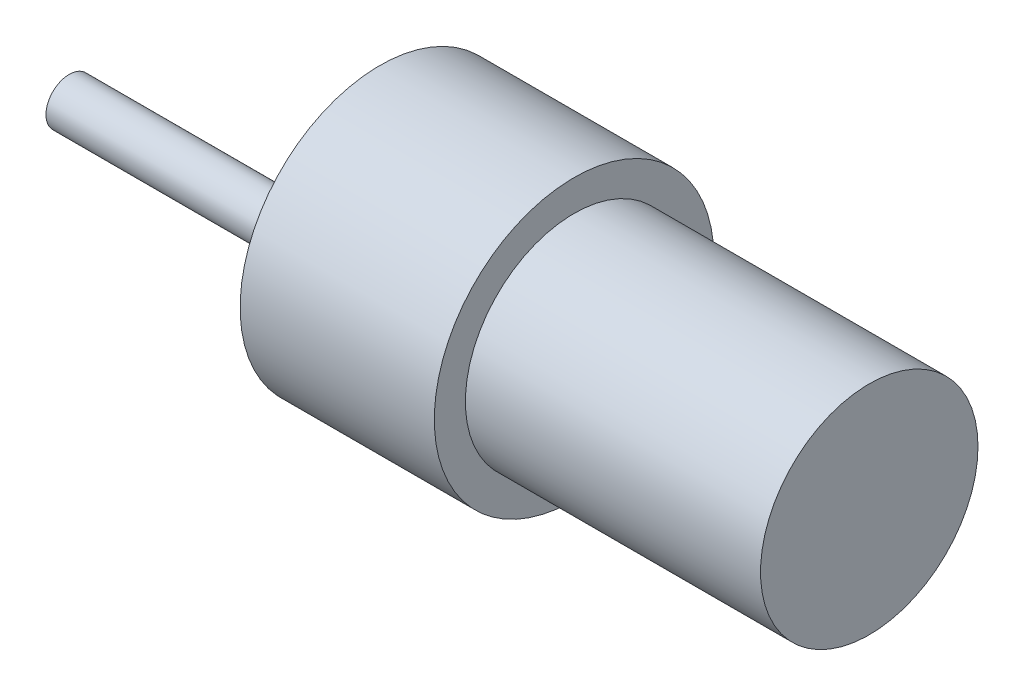
ISO-10303-21;
HEADER;
FILE_DESCRIPTION(('STEP AP214'),'2;1');
FILE_NAME('part.step','',(''),(''),'','','');
FILE_SCHEMA(('AUTOMOTIVE_DESIGN { 1 0 10303 214 1 1 1 1 }'));
ENDSEC;
DATA;
#1=APPLICATION_CONTEXT('core data for automotive mechanical design processes');
#2=APPLICATION_PROTOCOL_DEFINITION('international standard','automotive_design',2000,#1);
#3=PRODUCT_CONTEXT('',#1,'mechanical');
#4=PRODUCT('Part','Part','',(#3));
#5=PRODUCT_RELATED_PRODUCT_CATEGORY('part','',(#4));
#6=PRODUCT_DEFINITION_FORMATION('','',#4);
#7=PRODUCT_DEFINITION_CONTEXT('part definition',#1,'design');
#8=PRODUCT_DEFINITION('design','',#6,#7);
#9=PRODUCT_DEFINITION_SHAPE('','',#8);
#10=(LENGTH_UNIT() NAMED_UNIT(*) SI_UNIT(.MILLI.,.METRE.));
#11=(NAMED_UNIT(*) PLANE_ANGLE_UNIT() SI_UNIT($,.RADIAN.));
#12=(NAMED_UNIT(*) SI_UNIT($,.STERADIAN.) SOLID_ANGLE_UNIT());
#13=UNCERTAINTY_MEASURE_WITH_UNIT(LENGTH_MEASURE(1.E-05),#10,'distance_accuracy_value','');
#14=(GEOMETRIC_REPRESENTATION_CONTEXT(3) GLOBAL_UNCERTAINTY_ASSIGNED_CONTEXT((#13)) GLOBAL_UNIT_ASSIGNED_CONTEXT((#10,
#11,#12)) REPRESENTATION_CONTEXT('',''));
#15=CARTESIAN_POINT('',(0.,0.,0.));
#16=DIRECTION('',(0.,0.,1.));
#17=DIRECTION('',(1.,0.,0.));
#18=AXIS2_PLACEMENT_3D('',#15,#16,#17);
#19=CARTESIAN_POINT('',(46.3930952812002,0.,0.));
#20=DIRECTION('',(-1.,0.,0.));
#21=DIRECTION('',(0.,0.,1.));
#22=AXIS2_PLACEMENT_3D('',#19,#20,#21);
#23=PLANE('',#22);
#24=CARTESIAN_POINT('',(46.3930952812002,-6.,0.));
#25=DIRECTION('',(-1.,0.,0.));
#26=DIRECTION('',(0.,0.,1.));
#27=AXIS2_PLACEMENT_3D('',#24,#25,#26);
#28=CIRCLE('',#27,6.);
#29=CARTESIAN_POINT('',(46.3930952812002,-6.,6.));
#30=VERTEX_POINT('',#29);
#31=EDGE_CURVE('E10',#30,#30,#28,.T.);
#32=ORIENTED_EDGE('',*,*,#31,.F.);
#33=EDGE_LOOP('',(#32));
#34=FACE_BOUND('',#33,.T.);
#35=CARTESIAN_POINT('',(46.3930952812002,0.,0.));
#36=DIRECTION('',(1.,0.,0.));
#37=DIRECTION('',(0.,0.,-1.));
#38=AXIS2_PLACEMENT_3D('',#35,#36,#37);
#39=CIRCLE('',#38,18.);
#40=CARTESIAN_POINT('',(46.3930952812002,0.,-18.));
#41=VERTEX_POINT('',#40);
#42=EDGE_CURVE('E36',#41,#41,#39,.T.);
#43=ORIENTED_EDGE('',*,*,#42,.F.);
#44=EDGE_LOOP('',(#43));
#45=FACE_BOUND('',#44,.T.);
#46=ADVANCED_FACE('F30',(#34,#45),#23,.T.);
#47=CARTESIAN_POINT('',(109.3930952812,0.,0.));
#48=DIRECTION('',(1.,0.,0.));
#49=DIRECTION('',(0.,0.,-1.));
#50=AXIS2_PLACEMENT_3D('',#47,#48,#49);
#51=CYLINDRICAL_SURFACE('',#50,18.);
#52=ORIENTED_EDGE('',*,*,#42,.T.);
#53=EDGE_LOOP('',(#52));
#54=FACE_BOUND('',#53,.T.);
#55=CARTESIAN_POINT('',(71.3930952812002,0.,0.));
#56=DIRECTION('',(1.,0.,0.));
#57=DIRECTION('',(0.,0.,-1.));
#58=AXIS2_PLACEMENT_3D('',#55,#56,#57);
#59=CIRCLE('',#58,18.);
#60=CARTESIAN_POINT('',(71.3930952812002,0.,-18.));
#61=VERTEX_POINT('',#60);
#62=EDGE_CURVE('E40',#61,#61,#59,.T.);
#63=ORIENTED_EDGE('',*,*,#62,.F.);
#64=EDGE_LOOP('',(#63));
#65=FACE_BOUND('',#64,.T.);
#66=ADVANCED_FACE('F74',(#54,#65),#51,.T.);
#67=CARTESIAN_POINT('',(71.3930952812002,18.,0.));
#68=DIRECTION('',(1.,0.,0.));
#69=DIRECTION('',(0.,0.,-1.));
#70=AXIS2_PLACEMENT_3D('',#67,#68,#69);
#71=PLANE('',#70);
#72=ORIENTED_EDGE('',*,*,#62,.T.);
#73=EDGE_LOOP('',(#72));
#74=FACE_BOUND('',#73,.T.);
#75=CARTESIAN_POINT('',(71.3930952812002,0.,0.));
#76=DIRECTION('',(1.,0.,0.));
#77=DIRECTION('',(0.,0.,-1.));
#78=AXIS2_PLACEMENT_3D('',#75,#76,#77);
#79=CIRCLE('',#78,14.);
#80=CARTESIAN_POINT('',(71.3930952812002,0.,-14.));
#81=VERTEX_POINT('',#80);
#82=EDGE_CURVE('E44',#81,#81,#79,.T.);
#83=ORIENTED_EDGE('',*,*,#82,.F.);
#84=EDGE_LOOP('',(#83));
#85=FACE_BOUND('',#84,.T.);
#86=ADVANCED_FACE('F79',(#74,#85),#71,.T.);
#87=CARTESIAN_POINT('',(109.3930952812,0.,0.));
#88=DIRECTION('',(1.,0.,0.));
#89=DIRECTION('',(0.,0.,-1.));
#90=AXIS2_PLACEMENT_3D('',#87,#88,#89);
#91=CYLINDRICAL_SURFACE('',#90,14.);
#92=ORIENTED_EDGE('',*,*,#82,.T.);
#93=EDGE_LOOP('',(#92));
#94=FACE_BOUND('',#93,.T.);
#95=CARTESIAN_POINT('',(109.3930952812,0.,0.));
#96=DIRECTION('',(1.,0.,0.));
#97=DIRECTION('',(0.,0.,-1.));
#98=AXIS2_PLACEMENT_3D('',#95,#96,#97);
#99=CIRCLE('',#98,14.);
#100=CARTESIAN_POINT('',(109.3930952812,0.,-14.));
#101=VERTEX_POINT('',#100);
#102=EDGE_CURVE('E49',#101,#101,#99,.T.);
#103=ORIENTED_EDGE('',*,*,#102,.F.);
#104=EDGE_LOOP('',(#103));
#105=FACE_BOUND('',#104,.T.);
#106=ADVANCED_FACE('F84',(#94,#105),#91,.T.);
#107=CARTESIAN_POINT('',(109.3930952812,14.,0.));
#108=DIRECTION('',(1.,0.,0.));
#109=DIRECTION('',(0.,0.,-1.));
#110=AXIS2_PLACEMENT_3D('',#107,#108,#109);
#111=PLANE('',#110);
#112=ORIENTED_EDGE('',*,*,#102,.T.);
#113=EDGE_LOOP('',(#112));
#114=FACE_BOUND('',#113,.T.);
#115=ADVANCED_FACE('F91',(#114),#111,.T.);
#116=CARTESIAN_POINT('',(46.3930952812002,-6.,0.));
#117=DIRECTION('',(1.,0.,0.));
#118=DIRECTION('',(0.,0.,-1.));
#119=AXIS2_PLACEMENT_3D('',#116,#117,#118);
#120=CYLINDRICAL_SURFACE('',#119,6.);
#121=CARTESIAN_POINT('',(36.3930952812002,-6.,0.));
#122=DIRECTION('',(1.,0.,0.));
#123=DIRECTION('',(0.,0.,-1.));
#124=AXIS2_PLACEMENT_3D('',#121,#122,#123);
#125=CIRCLE('',#124,6.);
#126=CARTESIAN_POINT('',(36.3930952812002,-6.,-6.));
#127=VERTEX_POINT('',#126);
#128=EDGE_CURVE('E52',#127,#127,#125,.T.);
#129=ORIENTED_EDGE('',*,*,#128,.T.);
#130=EDGE_LOOP('',(#129));
#131=FACE_BOUND('',#130,.T.);
#132=ORIENTED_EDGE('',*,*,#31,.T.);
#133=EDGE_LOOP('',(#132));
#134=FACE_BOUND('',#133,.T.);
#135=ADVANCED_FACE('F95',(#131,#134),#120,.T.);
#136=CARTESIAN_POINT('',(36.3930952812002,0.,0.));
#137=DIRECTION('',(-1.,0.,0.));
#138=DIRECTION('',(0.,0.,1.));
#139=AXIS2_PLACEMENT_3D('',#136,#137,#138);
#140=PLANE('',#139);
#141=CARTESIAN_POINT('',(36.3930952812002,-6.,0.));
#142=DIRECTION('',(1.,0.,0.));
#143=DIRECTION('',(0.,0.,-1.));
#144=AXIS2_PLACEMENT_3D('',#141,#142,#143);
#145=CIRCLE('',#144,3.);
#146=CARTESIAN_POINT('',(36.3930952812002,-6.,-3.));
#147=VERTEX_POINT('',#146);
#148=EDGE_CURVE('E55',#147,#147,#145,.T.);
#149=ORIENTED_EDGE('',*,*,#148,.T.);
#150=EDGE_LOOP('',(#149));
#151=FACE_BOUND('',#150,.T.);
#152=ORIENTED_EDGE('',*,*,#128,.F.);
#153=EDGE_LOOP('',(#152));
#154=FACE_BOUND('',#153,.T.);
#155=ADVANCED_FACE('F71',(#151,#154),#140,.T.);
#156=CARTESIAN_POINT('',(46.3930952812002,-6.,0.));
#157=DIRECTION('',(1.,0.,0.));
#158=DIRECTION('',(0.,0.,-1.));
#159=AXIS2_PLACEMENT_3D('',#156,#157,#158);
#160=CYLINDRICAL_SURFACE('',#159,3.);
#161=CARTESIAN_POINT('',(6.39309528120018,-6.,0.));
#162=DIRECTION('',(1.,0.,0.));
#163=DIRECTION('',(0.,0.,-1.));
#164=AXIS2_PLACEMENT_3D('',#161,#162,#163);
#165=CIRCLE('',#164,2.99999999999999);
#166=CARTESIAN_POINT('',(6.39309528120018,-6.,-2.99999999999999));
#167=VERTEX_POINT('',#166);
#168=EDGE_CURVE('E58',#167,#167,#165,.T.);
#169=ORIENTED_EDGE('',*,*,#168,.T.);
#170=EDGE_LOOP('',(#169));
#171=FACE_BOUND('',#170,.T.);
#172=ORIENTED_EDGE('',*,*,#148,.F.);
#173=EDGE_LOOP('',(#172));
#174=FACE_BOUND('',#173,.T.);
#175=ADVANCED_FACE('F62',(#171,#174),#160,.T.);
#176=CARTESIAN_POINT('',(6.39309528120018,-3.,0.));
#177=DIRECTION('',(-1.,0.,0.));
#178=DIRECTION('',(0.,0.,1.));
#179=AXIS2_PLACEMENT_3D('',#176,#177,#178);
#180=PLANE('',#179);
#181=ORIENTED_EDGE('',*,*,#168,.F.);
#182=EDGE_LOOP('',(#181));
#183=FACE_BOUND('',#182,.T.);
#184=ADVANCED_FACE('F65',(#183),#180,.T.);
#185=CLOSED_SHELL('',(#46,#66,#86,#106,#115,#135,#155,#175,#184));
#186=MANIFOLD_SOLID_BREP('B2',#185);
#187=ADVANCED_BREP_SHAPE_REPRESENTATION('',(#18,#186),#14);
#188=SHAPE_DEFINITION_REPRESENTATION(#9,#187);
ENDSEC;
END-ISO-10303-21;
